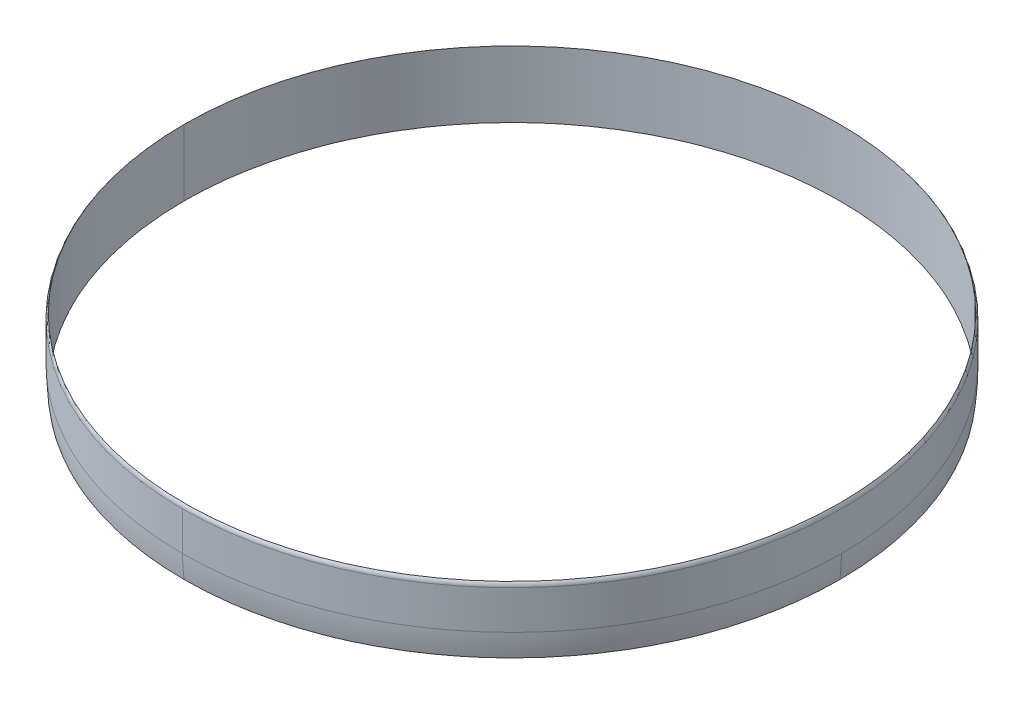
ISO-10303-21;
HEADER;
FILE_DESCRIPTION(('STEP AP214'),'2;1');
FILE_NAME('part.step','',(''),(''),'','','');
FILE_SCHEMA(('AUTOMOTIVE_DESIGN { 1 0 10303 214 1 1 1 1 }'));
ENDSEC;
DATA;
#1=APPLICATION_CONTEXT('core data for automotive mechanical design processes');
#2=APPLICATION_PROTOCOL_DEFINITION('international standard','automotive_design',2000,#1);
#3=PRODUCT_CONTEXT('',#1,'mechanical');
#4=PRODUCT('Part','Part','',(#3));
#5=PRODUCT_RELATED_PRODUCT_CATEGORY('part','',(#4));
#6=PRODUCT_DEFINITION_FORMATION('','',#4);
#7=PRODUCT_DEFINITION_CONTEXT('part definition',#1,'design');
#8=PRODUCT_DEFINITION('design','',#6,#7);
#9=PRODUCT_DEFINITION_SHAPE('','',#8);
#10=(LENGTH_UNIT() NAMED_UNIT(*) SI_UNIT(.MILLI.,.METRE.));
#11=(NAMED_UNIT(*) PLANE_ANGLE_UNIT() SI_UNIT($,.RADIAN.));
#12=(NAMED_UNIT(*) SI_UNIT($,.STERADIAN.) SOLID_ANGLE_UNIT());
#13=UNCERTAINTY_MEASURE_WITH_UNIT(LENGTH_MEASURE(1.E-05),#10,'distance_accuracy_value','');
#14=(GEOMETRIC_REPRESENTATION_CONTEXT(3) GLOBAL_UNCERTAINTY_ASSIGNED_CONTEXT((#13)) GLOBAL_UNIT_ASSIGNED_CONTEXT((#10,
#11,#12)) REPRESENTATION_CONTEXT('',''));
#15=CARTESIAN_POINT('',(0.,0.,0.));
#16=DIRECTION('',(0.,0.,1.));
#17=DIRECTION('',(1.,0.,0.));
#18=AXIS2_PLACEMENT_3D('',#15,#16,#17);
#19=CARTESIAN_POINT('',(5.07460071940085,-5.31215064223712,0.0398565952627643));
#20=CARTESIAN_POINT('',(5.07677797983758,-5.31215064223712,-0.239133826858269));
#21=CARTESIAN_POINT('',(5.0360574572875,-5.31215064223712,-0.784180289500473));
#22=CARTESIAN_POINT('',(4.84627020965909,-5.31215064223712,-1.57464950831854));
#23=CARTESIAN_POINT('',(4.5402783707503,-5.31215064223712,-2.3133870219321));
#24=CARTESIAN_POINT('',(4.12248568042579,-5.31215064223712,-2.99516129099835));
#25=CARTESIAN_POINT('',(3.60318481666137,-5.31215064223712,-3.60318481666137));
#26=CARTESIAN_POINT('',(2.99516129099835,-5.31215064223712,-4.12248568042579));
#27=CARTESIAN_POINT('',(2.3133870219321,-5.31215064223712,-4.5402783707503));
#28=CARTESIAN_POINT('',(1.5746495083188,-5.31215064223712,-4.84627020965909));
#29=CARTESIAN_POINT('',(0.784180289499751,-5.31215064223712,-5.03605745728761));
#30=CARTESIAN_POINT('',(0.23913382686036,-5.31215064223712,-5.07677797983765));
#31=CARTESIAN_POINT('',(-0.0398565952629927,-5.31215064223712,-5.07460071940084));
#32=CARTESIAN_POINT('',(5.07885840714978,-5.28018567461216,0.0398900357138964));
#33=CARTESIAN_POINT('',(5.0810374943511,-5.28018567461217,-0.239334464745136));
#34=CARTESIAN_POINT('',(5.04028280649672,-5.28018567461217,-0.784838231868048));
#35=CARTESIAN_POINT('',(4.85033632371177,-5.28018567461217,-1.57597066958663));
#36=CARTESIAN_POINT('',(4.54408775175589,-5.28018567461217,-2.31532799820335));
#37=CARTESIAN_POINT('',(4.12594452531678,-5.28018567461217,-2.9976742890127));
#38=CARTESIAN_POINT('',(3.60620795812466,-5.28018567461217,-3.60620795812466));
#39=CARTESIAN_POINT('',(2.9976742890127,-5.28018567461217,-4.12594452531678));
#40=CARTESIAN_POINT('',(2.31532799820335,-5.28018567461217,-4.54408775175589));
#41=CARTESIAN_POINT('',(1.57597066958688,-5.28018567461217,-4.85033632371177));
#42=CARTESIAN_POINT('',(0.784838231867325,-5.28018567461217,-5.04028280649684));
#43=CARTESIAN_POINT('',(0.239334464747247,-5.28018567461216,-5.08103749435117));
#44=CARTESIAN_POINT('',(-0.039890035714118,-5.28018567461216,-5.07885840714977));
#45=CARTESIAN_POINT('',(5.09287700843605,-5.15850268669196,0.0400001396902587));
#46=CARTESIAN_POINT('',(5.09506211032523,-5.15850268669196,-0.239995072733471));
#47=CARTESIAN_POINT('',(5.05419493189443,-5.15850268669196,-0.787004532513923));
#48=CARTESIAN_POINT('',(4.86372416121044,-5.15850268669196,-1.58032064406622));
#49=CARTESIAN_POINT('',(4.55663028578536,-5.15850268669196,-2.3217187375097));
#50=CARTESIAN_POINT('',(4.13733290565511,-5.15850268669196,-3.00594843199547));
#51=CARTESIAN_POINT('',(3.616161768109,-5.15850268669196,-3.616161768109));
#52=CARTESIAN_POINT('',(3.00594843199548,-5.15850268669196,-4.13733290565511));
#53=CARTESIAN_POINT('',(2.3217187375097,-5.15850268669196,-4.55663028578535));
#54=CARTESIAN_POINT('',(1.58032064406647,-5.15850268669196,-4.86372416121044));
#55=CARTESIAN_POINT('',(0.787004532513199,-5.15850268669196,-5.05419493189455));
#56=CARTESIAN_POINT('',(0.239995072735576,-5.15850268669196,-5.09506211032531));
#57=CARTESIAN_POINT('',(-0.0400001396904847,-5.15850268669196,-5.09287700843604));
#58=CARTESIAN_POINT('',(5.0999090152672,-5.03774586597889,0.04005537001587));
#59=CARTESIAN_POINT('',(5.1020971342436,-5.0377458659789,-0.240326446726554));
#60=CARTESIAN_POINT('',(5.06117352831954,-5.0377458659789,-0.788091191633832));
#61=CARTESIAN_POINT('',(4.87043976448689,-5.0377458659789,-1.58250267703967));
#62=CARTESIAN_POINT('',(4.56292186817567,-5.0377458659789,-2.32492445836126));
#63=CARTESIAN_POINT('',(4.14304554179493,-5.0377458659789,-3.01009890526681));
#64=CARTESIAN_POINT('',(3.62115479547207,-5.0377458659789,-3.62115479547207));
#65=CARTESIAN_POINT('',(3.01009890526932,-5.0377458659789,-4.14304554179493));
#66=CARTESIAN_POINT('',(2.32492445836126,-5.0377458659789,-4.56292186817315));
#67=CARTESIAN_POINT('',(1.58250267703993,-5.0377458659789,-4.87043976448689));
#68=CARTESIAN_POINT('',(0.788091191633347,-5.0377458659789,-5.06117352831966));
#69=CARTESIAN_POINT('',(0.24032644672771,-5.0377458659789,-5.10209713424367));
#70=CARTESIAN_POINT('',(-0.040055370015967,-5.0377458659789,-5.09990901526718));
#71=CARTESIAN_POINT('',(5.09983850957957,-4.94819430474783,0.0400548162547285));
#72=CARTESIAN_POINT('',(5.10202659830462,-4.94819430474783,-0.240323124239591));
#73=CARTESIAN_POINT('',(5.06110355814651,-4.94819430474783,-0.78808029635899));
#74=CARTESIAN_POINT('',(4.8703724311862,-4.94819430474783,-1.58248079911257));
#75=CARTESIAN_POINT('',(4.56285878627498,-4.94819430474783,-2.32489231653352));
#76=CARTESIAN_POINT('',(4.14298826464156,-4.94819430474783,-3.01005729097771));
#77=CARTESIAN_POINT('',(3.62110473340126,-4.94819430474783,-3.62110473340126));
#78=CARTESIAN_POINT('',(3.01005729097776,-4.94819430474783,-4.14298826464156));
#79=CARTESIAN_POINT('',(2.32489231653352,-4.94819430474783,-4.56285878627493));
#80=CARTESIAN_POINT('',(1.58248079911257,-4.94819430474783,-4.8703724311862));
#81=CARTESIAN_POINT('',(0.788080296358495,-4.94819430474783,-5.06110355814662));
#82=CARTESIAN_POINT('',(0.240323124240781,-4.94819430474783,-5.10202659830469));
#83=CARTESIAN_POINT('',(-0.040054816254826,-4.94819430474783,-5.09983850957956));
#84=B_SPLINE_SURFACE_WITH_KNOTS('',3,3,((#19,#20,#21,#22,#23,#24,#25,#26,#27,#28,#29,#30,#31),
(#32,#33,#34,#35,#36,#37,#38,#39,#40,#41,#42,#43,#44),(#45,#46,#47,#48,#49,#50,#51,#52,#53,#54,
#55,#56,#57),(#58,#59,#60,#61,#62,#63,#64,#65,#66,#67,#68,#69,#70),(#71,#72,#73,#74,#75,#76,#77,
#78,#79,#80,#81,#82,#83)),.UNSPECIFIED.,.F.,.F.,.F.,(4,1,4),(4,1,1,1,1,1,1,1,1,1,4),
(0.00378229550405859,0.264970651443808,0.995047089156655),(0.015000022706526,0.12,0.22,0.32,
0.42,0.52,0.62,0.72,0.82,0.92,1.02499997729366),.UNSPECIFIED.);
#85=CARTESIAN_POINT('',(5.07484010522801,-5.31034885046992,0.039858475431186));
#86=CARTESIAN_POINT('',(5.07701746837343,-5.31034885046992,-0.239145107597802));
#87=CARTESIAN_POINT('',(5.03629502490051,-5.31034885046992,-0.784217281898031));
#88=CARTESIAN_POINT('',(4.84649882437516,-5.31034885046992,-1.57472378978341));
#89=CARTESIAN_POINT('',(4.54049255081158,-5.31034885046992,-2.31349615210734));
#90=CARTESIAN_POINT('',(4.12268015181357,-5.31034885046992,-2.99530258273785));
#91=CARTESIAN_POINT('',(3.6033547908968,-5.31034885046992,-3.6033547908968));
#92=CARTESIAN_POINT('',(2.99530258273785,-5.31034885046992,-4.12268015181357));
#93=CARTESIAN_POINT('',(2.31349615210734,-5.31034885046992,-4.54049255081158));
#94=CARTESIAN_POINT('',(1.57472378978367,-5.31034885046992,-4.84649882437516));
#95=CARTESIAN_POINT('',(0.784217281897309,-5.31034885046992,-5.03629502490063));
#96=CARTESIAN_POINT('',(0.239145107599894,-5.31034885046992,-5.0770174683735));
#97=CARTESIAN_POINT('',(-0.039858475431414,-5.31034885046992,-5.07484010522799));
#98=B_SPLINE_CURVE_WITH_KNOTS('',3,(#85,#86,#87,#88,#89,#90,#91,#92,#93,#94,#95,#96,#97),
.UNSPECIFIED.,.F.,.F.,(4,1,1,1,1,1,1,1,1,1,4),(0.015000022706526,0.12,0.22,0.32,0.42,0.52,0.62,
0.72,0.82,0.92,1.02499997729366),.UNSPECIFIED.);
#99=CARTESIAN_POINT('',(-7.81112865682848E-11,-5.31034921607361,-5.07499724113776));
#100=VERTEX_POINT('',#99);
#101=CARTESIAN_POINT('',(5.07499724113776,-5.31034921601011,-7.81117187978163E-11));
#102=VERTEX_POINT('',#101);
#103=EDGE_CURVE('E10',#100,#102,#98,.F.);
#104=CARTESIAN_POINT('',(-3.1243119257094E-10,-5.31215064223712,-5.07475508916185));
#105=CARTESIAN_POINT('',(-3.12684391047665E-10,-5.28018567461216,-5.07901290643014));
#106=CARTESIAN_POINT('',(-3.13556941709489E-10,-5.15850268669196,-5.09303193416321));
#107=CARTESIAN_POINT('',(-3.14000497288582E-10,-5.0377458659789,-5.10006415490864));
#108=CARTESIAN_POINT('',(-3.13981855787479E-10,-4.94819430474783,-5.09999364707611));
#109=B_SPLINE_CURVE_WITH_KNOTS('',3,(#104,#105,#106,#107,#108),.UNSPECIFIED.,.F.,.F.,(4,1,4),
(0.00378229550405859,0.264970651443808,0.995047089156655),.UNSPECIFIED.);
#110=CARTESIAN_POINT('',(-7.84951123561546E-11,-4.95000000025452,-5.09999717886902));
#111=VERTEX_POINT('',#110);
#112=EDGE_CURVE('E26',#100,#111,#109,.T.);
#113=CARTESIAN_POINT('',(-0.0400548218362915,-4.95000000025453,-5.09983922022));
#114=CARTESIAN_POINT('',(0.240323157728767,-4.95000000025453,-5.10202730925005));
#115=CARTESIAN_POINT('',(0.788080406174072,-4.95000000025453,-5.0611042633895));
#116=CARTESIAN_POINT('',(1.58248101962443,-4.95000000025453,-4.87037310985154));
#117=CARTESIAN_POINT('',(2.32489264049721,-4.95000000025453,-4.56285942208955));
#118=CARTESIAN_POINT('',(3.01005771041626,-4.95000000025453,-4.14298884194904));
#119=CARTESIAN_POINT('',(3.62110523798653,-4.95000000025453,-3.62110523798653));
#120=CARTESIAN_POINT('',(4.14298884194904,-4.95000000025453,-3.01005771041616));
#121=CARTESIAN_POINT('',(4.56285942208966,-4.95000000025453,-2.32489264049721));
#122=CARTESIAN_POINT('',(4.87037310985154,-4.95000000025453,-1.58248101962442));
#123=CARTESIAN_POINT('',(5.06110426338938,-4.95000000025453,-0.788080406174567));
#124=CARTESIAN_POINT('',(5.10202730924997,-4.95000000025453,-0.240323157727578));
#125=CARTESIAN_POINT('',(5.09983922022001,-4.95000000025453,0.0400548218361941));
#126=B_SPLINE_CURVE_WITH_KNOTS('',3,(#113,#114,#115,#116,#117,#118,#119,#120,#121,#122,#123,
#124,#125),.UNSPECIFIED.,.F.,.F.,(4,1,1,1,1,1,1,1,1,1,4),(0.0150000227065259,0.12000000000019,
0.22000000000019,0.32000000000019,0.42000000000019,0.52000000000019,0.62000000000019,
0.72000000000019,0.82000000000019,0.92000000000019,1.02499997729366),.UNSPECIFIED.);
#127=CARTESIAN_POINT('',(5.09999717886903,-4.95000000017515,-7.84941047063996E-11));
#128=VERTEX_POINT('',#127);
#129=EDGE_CURVE('E398',#128,#111,#126,.F.);
#130=CARTESIAN_POINT('',(5.07475508917236,-5.31215064215816,-3.12433125500126E-10));
#131=CARTESIAN_POINT('',(5.07901290643622,-5.28018567455937,-3.12695243233786E-10));
#132=CARTESIAN_POINT('',(5.09303193416785,-5.15850268663872,-3.13556221731483E-10));
#133=CARTESIAN_POINT('',(5.10006415491176,-5.03774586592522,-3.13998901478509E-10));
#134=CARTESIAN_POINT('',(5.09999364707605,-4.94819430466676,-3.13985111782128E-10));
#135=B_SPLINE_CURVE_WITH_KNOTS('',3,(#130,#131,#132,#133,#134),.UNSPECIFIED.,.F.,.F.,(4,1,4),
(0.00378229571909672,0.264970651443594,0.99504708937697),.UNSPECIFIED.);
#136=EDGE_CURVE('E374',#102,#128,#135,.T.);
#137=ORIENTED_EDGE('',*,*,#103,.F.);
#138=ORIENTED_EDGE('',*,*,#112,.T.);
#139=ORIENTED_EDGE('',*,*,#129,.F.);
#140=ORIENTED_EDGE('',*,*,#136,.F.);
#141=EDGE_LOOP('',(#137,#138,#139,#140));
#142=FACE_BOUND('',#141,.T.);
#143=ADVANCED_FACE('F15',(#142),#84,.F.);
#144=CARTESIAN_POINT('',(-0.0398565952570717,-5.31215064215816,5.07460071941141));
#145=CARTESIAN_POINT('',(0.239133826861258,-5.31215064215816,5.07677797984782));
#146=CARTESIAN_POINT('',(0.784180289504398,-5.31215064215816,5.03605745729749));
#147=CARTESIAN_POINT('',(1.57464950832179,-5.31215064215816,4.84627020966913));
#148=CARTESIAN_POINT('',(2.31338702193689,-5.31215064215816,4.54027837075971));
#149=CARTESIAN_POINT('',(2.99516129100455,-5.31215064215816,4.12248568043434));
#150=CARTESIAN_POINT('',(3.60318481666883,-5.31215064215816,3.60318481666883));
#151=CARTESIAN_POINT('',(4.12248568043434,-5.31215064215816,2.99516129100455));
#152=CARTESIAN_POINT('',(4.54027837075971,-5.31215064215816,2.31338702193689));
#153=CARTESIAN_POINT('',(4.84627020966913,-5.31215064215816,1.5746495083218));
#154=CARTESIAN_POINT('',(5.03605745729751,-5.31215064215816,0.784180289503603));
#155=CARTESIAN_POINT('',(5.07677797984783,-5.31215064215816,0.239133826863158));
#156=CARTESIAN_POINT('',(5.0746007194114,-5.31215064215816,-0.0398565952573382));
#157=CARTESIAN_POINT('',(-0.0398900357081564,-5.28018567455937,5.07885840715591));
#158=CARTESIAN_POINT('',(0.23933446474794,-5.28018567455937,5.0810374943569));
#159=CARTESIAN_POINT('',(0.784838231871278,-5.28018567455937,5.04028280650232));
#160=CARTESIAN_POINT('',(1.57597066958825,-5.28018567455937,4.85033632371757));
#161=CARTESIAN_POINT('',(2.31532799820612,-5.28018567455937,4.54408775176133));
#162=CARTESIAN_POINT('',(2.99767428901629,-5.28018567455937,4.12594452532172));
#163=CARTESIAN_POINT('',(3.60620795812898,-5.28018567455937,3.60620795812898));
#164=CARTESIAN_POINT('',(4.12594452532172,-5.28018567455937,2.99767428901629));
#165=CARTESIAN_POINT('',(4.54408775176133,-5.28018567455937,2.31532799820612));
#166=CARTESIAN_POINT('',(4.85033632371757,-5.28018567455937,1.57597066958851));
#167=CARTESIAN_POINT('',(5.04028280650234,-5.28018567455937,0.784838231870492));
#168=CARTESIAN_POINT('',(5.08103749435691,-5.28018567455937,0.239334464749883));
#169=CARTESIAN_POINT('',(5.0788584071559,-5.28018567455937,-0.0398900357084412));
#170=CARTESIAN_POINT('',(-0.0400001396845016,-5.15850268663872,5.09287700844074));
#171=CARTESIAN_POINT('',(0.239995072736239,-5.15850268663872,5.09506211032959));
#172=CARTESIAN_POINT('',(0.787004532516935,-5.15850268663872,5.0541949318986));
#173=CARTESIAN_POINT('',(1.5803206440674,-5.15850268663872,4.86372416121487));
#174=CARTESIAN_POINT('',(2.32171873751182,-5.15850268663872,4.5566302857895));
#175=CARTESIAN_POINT('',(3.00594843199821,-5.15850268663872,4.13733290565888));
#176=CARTESIAN_POINT('',(3.6161617681123,-5.15850268663872,3.6161617681123));
#177=CARTESIAN_POINT('',(4.13733290565888,-5.15850268663872,3.00594843199821));
#178=CARTESIAN_POINT('',(4.55663028578951,-5.15850268663872,2.32171873751182));
#179=CARTESIAN_POINT('',(4.86372416121487,-5.15850268663872,1.58032064406766));
#180=CARTESIAN_POINT('',(5.05419493189861,-5.15850268663872,0.787004532515911));
#181=CARTESIAN_POINT('',(5.09506211032961,-5.15850268663872,0.239995072738367));
#182=CARTESIAN_POINT('',(5.09287700844073,-5.15850268663872,-0.0400001396847997));
#183=CARTESIAN_POINT('',(-0.0400553700101031,-5.03774586592522,5.09990901527036));
#184=CARTESIAN_POINT('',(0.240326446729322,-5.03774586592522,5.10209713424644));
#185=CARTESIAN_POINT('',(0.788091191636624,-5.03774586592522,5.0611735283222));
#186=CARTESIAN_POINT('',(1.58250267704064,-5.03774586592522,4.87043976448987));
#187=CARTESIAN_POINT('',(2.32492445836268,-5.03774586592522,4.56292186817595));
#188=CARTESIAN_POINT('',(3.01009890526865,-5.03774586592522,4.14304554179747));
#189=CARTESIAN_POINT('',(3.62115479547429,-5.03774586592522,3.62115479547429));
#190=CARTESIAN_POINT('',(4.14304554179747,-5.03774586592522,3.01009890526865));
#191=CARTESIAN_POINT('',(4.56292186817846,-5.03774586592522,2.32492445836268));
#192=CARTESIAN_POINT('',(4.87043976448987,-5.03774586592522,1.58250267704064));
#193=CARTESIAN_POINT('',(5.06117352832222,-5.03774586592522,0.788091191635826));
#194=CARTESIAN_POINT('',(5.10209713424645,-5.03774586592522,0.240326446731199));
#195=CARTESIAN_POINT('',(5.09990901527036,-5.03774586592522,-0.0400553700103787));
#196=CARTESIAN_POINT('',(-0.0400548162489352,-4.94819430466676,5.09983850957955));
#197=CARTESIAN_POINT('',(0.240323124242198,-4.94819430466676,5.10202659830427));
#198=CARTESIAN_POINT('',(0.788080296361041,-4.94819430466676,5.061103558146));
#199=CARTESIAN_POINT('',(1.5824807991123,-4.94819430466676,4.87037243118614));
#200=CARTESIAN_POINT('',(2.3248923165335,-4.94819430466676,4.56285878627487));
#201=CARTESIAN_POINT('',(3.01005729097768,-4.94819430466676,4.14298826464151));
#202=CARTESIAN_POINT('',(3.62110473340122,-4.94819430466676,3.62110473340122));
#203=CARTESIAN_POINT('',(4.14298826464151,-4.94819430466676,3.01005729097768));
#204=CARTESIAN_POINT('',(4.56285878627492,-4.94819430466676,2.3248923165335));
#205=CARTESIAN_POINT('',(4.87037243118614,-4.94819430466676,1.58248079911255));
#206=CARTESIAN_POINT('',(5.06110355814602,-4.94819430466676,0.788080296360256));
#207=CARTESIAN_POINT('',(5.10202659830428,-4.94819430466676,0.240323124244073));
#208=CARTESIAN_POINT('',(5.09983850957955,-4.94819430466676,-0.0400548162492105));
#209=B_SPLINE_SURFACE_WITH_KNOTS('',3,3,((#144,#145,#146,#147,#148,#149,#150,#151,#152,#153,
#154,#155,#156),(#157,#158,#159,#160,#161,#162,#163,#164,#165,#166,#167,#168,#169),(#170,#171,
#172,#173,#174,#175,#176,#177,#178,#179,#180,#181,#182),(#183,#184,#185,#186,#187,#188,#189,
#190,#191,#192,#193,#194,#195),(#196,#197,#198,#199,#200,#201,#202,#203,#204,#205,#206,#207,
#208)),.UNSPECIFIED.,.F.,.F.,.F.,(4,1,4),(4,1,1,1,1,1,1,1,1,1,4),(0.00378229571909672,
0.264970651443594,0.99504708937697),(0.0150000227072264,0.11999999999999,0.21999999999999,
0.31999999999999,0.41999999999999,0.51999999999999,0.61999999999999,0.71999999999999,
0.81999999999999,0.91999999999999,1.02499997729279),.UNSPECIFIED.);
#210=CARTESIAN_POINT('',(-0.0398584754256699,-5.3103488502203,5.07484010526113));
#211=CARTESIAN_POINT('',(0.239145107601856,-5.3103488502203,5.07701746840624));
#212=CARTESIAN_POINT('',(0.784217281905442,-5.3103488502203,5.0362950249329));
#213=CARTESIAN_POINT('',(1.57472378979365,-5.3103488502203,4.84649882440675));
#214=CARTESIAN_POINT('',(2.31349615212242,-5.3103488502203,4.54049255084118));
#215=CARTESIAN_POINT('',(2.99530258275738,-5.3103488502203,4.12268015184044));
#216=CARTESIAN_POINT('',(3.60335479092028,-5.3103488502203,3.60335479092028));
#217=CARTESIAN_POINT('',(4.12268015184044,-5.3103488502203,2.99530258275738));
#218=CARTESIAN_POINT('',(4.54049255084118,-5.3103488502203,2.31349615212242));
#219=CARTESIAN_POINT('',(4.84649882440675,-5.3103488502203,1.57472378979367));
#220=CARTESIAN_POINT('',(5.03629502493292,-5.3103488502203,0.784217281904647));
#221=CARTESIAN_POINT('',(5.07701746840626,-5.3103488502203,0.239145107603758));
#222=CARTESIAN_POINT('',(5.07484010526113,-5.3103488502203,-0.0398584754259374));
#223=B_SPLINE_CURVE_WITH_KNOTS('',3,(#210,#211,#212,#213,#214,#215,#216,#217,#218,#219,#220,
#221,#222),.UNSPECIFIED.,.F.,.F.,(4,1,1,1,1,1,1,1,1,1,4),(0.0150000227072264,0.11999999999999,
0.21999999999999,0.31999999999999,0.41999999999999,0.51999999999999,0.61999999999999,
0.71999999999999,0.81999999999999,0.91999999999999,1.02499997729279),.UNSPECIFIED.);
#224=CARTESIAN_POINT('',(-2.38083561135862E-13,-5.31034921601011,5.07499724113776));
#225=VERTEX_POINT('',#224);
#226=EDGE_CURVE('E289',#102,#225,#223,.F.);
#227=CARTESIAN_POINT('',(5.09983922022005,-4.95000000008783,-0.0400548218306766));
#228=CARTESIAN_POINT('',(5.1020273092497,-4.95000000008783,0.240323157732064));
#229=CARTESIAN_POINT('',(5.06110426338896,-4.95000000008783,0.788080406175848));
#230=CARTESIAN_POINT('',(4.87037310985154,-4.95000000008783,1.58248101962442));
#231=CARTESIAN_POINT('',(4.56285942208966,-4.95000000008783,2.32489264049721));
#232=CARTESIAN_POINT('',(4.14298884194904,-4.95000000008783,3.01005771041616));
#233=CARTESIAN_POINT('',(3.62110523798653,-4.95000000008783,3.62110523798653));
#234=CARTESIAN_POINT('',(3.01005771041616,-4.95000000008783,4.14298884194904));
#235=CARTESIAN_POINT('',(2.32489264049721,-4.95000000008783,4.56285942208955));
#236=CARTESIAN_POINT('',(1.58248101962418,-4.95000000008783,4.87037310985154));
#237=CARTESIAN_POINT('',(0.788080406176632,-4.95000000008783,5.06110426338894));
#238=CARTESIAN_POINT('',(0.240323157730188,-4.95000000008783,5.10202730924969));
#239=CARTESIAN_POINT('',(-0.0400548218304012,-4.95000000008783,5.09983922022005));
#240=B_SPLINE_CURVE_WITH_KNOTS('',3,(#227,#228,#229,#230,#231,#232,#233,#234,#235,#236,#237,
#238,#239),.UNSPECIFIED.,.F.,.F.,(4,1,1,1,1,1,1,1,1,1,4),(0.0150000227072264,0.120000000000026,
0.220000000000026,0.320000000000026,0.420000000000026,0.520000000000026,0.620000000000026,
0.720000000000026,0.820000000000026,0.920000000000026,1.02499997729279),.UNSPECIFIED.);
#241=CARTESIAN_POINT('',(-9.29964012529017E-13,-4.95000000017515,5.09999717886902));
#242=VERTEX_POINT('',#241);
#243=EDGE_CURVE('E287',#242,#128,#240,.F.);
#244=CARTESIAN_POINT('',(3.12426283167978E-10,-5.31215064223712,5.07475508916185));
#245=CARTESIAN_POINT('',(3.12689115797445E-10,-5.28018567461217,5.07901290643013));
#246=CARTESIAN_POINT('',(3.13562100140137E-10,-5.15850268669197,5.09303193416321));
#247=CARTESIAN_POINT('',(3.13991694922194E-10,-5.0377458659789,5.10006415490864));
#248=CARTESIAN_POINT('',(3.13987280186473E-10,-4.94819430474783,5.09999364707611));
#249=B_SPLINE_CURVE_WITH_KNOTS('',3,(#244,#245,#246,#247,#248),.UNSPECIFIED.,.F.,.F.,(4,1,4),
(0.00378229550404038,0.264970651443381,0.995047089156651),.UNSPECIFIED.);
#250=EDGE_CURVE('E282',#225,#242,#249,.T.);
#251=ORIENTED_EDGE('',*,*,#226,.F.);
#252=ORIENTED_EDGE('',*,*,#136,.T.);
#253=ORIENTED_EDGE('',*,*,#243,.F.);
#254=ORIENTED_EDGE('',*,*,#250,.F.);
#255=EDGE_LOOP('',(#251,#252,#253,#254));
#256=FACE_BOUND('',#255,.T.);
#257=ADVANCED_FACE('F245',(#256),#209,.F.);
#258=CARTESIAN_POINT('',(-5.07460071940085,-5.31215064223712,-0.0398565952625982));
#259=CARTESIAN_POINT('',(-5.07677797983757,-5.31215064223712,0.239133826857249));
#260=CARTESIAN_POINT('',(-5.03605745728749,-5.31215064223712,0.784180289500976));
#261=CARTESIAN_POINT('',(-4.84627020965909,-5.31215064223712,1.57464950831852));
#262=CARTESIAN_POINT('',(-4.5402783707503,-5.31215064223712,2.3133870219321));
#263=CARTESIAN_POINT('',(-4.12248568042579,-5.31215064223712,2.99516129099835));
#264=CARTESIAN_POINT('',(-3.60318481666137,-5.31215064223712,3.60318481666137));
#265=CARTESIAN_POINT('',(-2.99516129099835,-5.31215064223712,4.12248568042579));
#266=CARTESIAN_POINT('',(-2.31338702193185,-5.31215064223712,4.5402783707503));
#267=CARTESIAN_POINT('',(-1.57464950831879,-5.31215064223712,4.84627020965909));
#268=CARTESIAN_POINT('',(-0.784180289499905,-5.31215064223712,5.03605745728763));
#269=CARTESIAN_POINT('',(-0.239133826860253,-5.31215064223712,5.07677797983766));
#270=CARTESIAN_POINT('',(0.0398565952629524,-5.31215064223712,5.07460071940083));
#271=CARTESIAN_POINT('',(-5.07885840714978,-5.28018567461217,-0.0398900357137457));
#272=CARTESIAN_POINT('',(-5.08103749435109,-5.28018567461217,0.239334464744115));
#273=CARTESIAN_POINT('',(-5.04028280649672,-5.28018567461217,0.784838231868537));
#274=CARTESIAN_POINT('',(-4.85033632371177,-5.28018567461217,1.57597066958637));
#275=CARTESIAN_POINT('',(-4.54408775175589,-5.28018567461217,2.31532799820335));
#276=CARTESIAN_POINT('',(-4.12594452531678,-5.28018567461217,2.9976742890127));
#277=CARTESIAN_POINT('',(-3.60620795812466,-5.28018567461217,3.60620795812466));
#278=CARTESIAN_POINT('',(-2.9976742890127,-5.28018567461217,4.12594452531678));
#279=CARTESIAN_POINT('',(-2.3153279982031,-5.28018567461217,4.54408775175589));
#280=CARTESIAN_POINT('',(-1.57597066958688,-5.28018567461217,4.85033632371177));
#281=CARTESIAN_POINT('',(-0.784838231867477,-5.28018567461217,5.04028280649686));
#282=CARTESIAN_POINT('',(-0.239334464747054,-5.28018567461217,5.08103749435118));
#283=CARTESIAN_POINT('',(0.0398900357140756,-5.28018567461217,5.07885840714977));
#284=CARTESIAN_POINT('',(-5.09287700843605,-5.15850268669197,-0.0400001396900993));
#285=CARTESIAN_POINT('',(-5.09506211032523,-5.15850268669197,0.239995072732461));
#286=CARTESIAN_POINT('',(-5.05419493189442,-5.15850268669197,0.787004532514174));
#287=CARTESIAN_POINT('',(-4.86372416121044,-5.15850268669197,1.58032064406596));
#288=CARTESIAN_POINT('',(-4.55663028578535,-5.15850268669197,2.3217187375097));
#289=CARTESIAN_POINT('',(-4.13733290565511,-5.15850268669197,3.00594843199547));
#290=CARTESIAN_POINT('',(-3.616161768109,-5.15850268669197,3.616161768109));
#291=CARTESIAN_POINT('',(-3.00594843199547,-5.15850268669197,4.13733290565511));
#292=CARTESIAN_POINT('',(-2.3217187375097,-5.15850268669197,4.55663028578535));
#293=CARTESIAN_POINT('',(-1.58032064406622,-5.15850268669197,4.86372416121044));
#294=CARTESIAN_POINT('',(-0.7870045325131,-5.15850268669197,5.05419493189457));
#295=CARTESIAN_POINT('',(-0.239995072735245,-5.15850268669197,5.09506211032532));
#296=CARTESIAN_POINT('',(0.0400001396904207,-5.15850268669197,5.09287700843604));
#297=CARTESIAN_POINT('',(-5.0999090152672,-5.0377458659789,-0.0400553700157132));
#298=CARTESIAN_POINT('',(-5.10209713424359,-5.0377458659789,0.240326446725599));
#299=CARTESIAN_POINT('',(-5.06117352831953,-5.0377458659789,0.788091191634332));
#300=CARTESIAN_POINT('',(-4.87043976448689,-5.0377458659789,1.58250267703967));
#301=CARTESIAN_POINT('',(-4.56292186817315,-5.0377458659789,2.32492445836126));
#302=CARTESIAN_POINT('',(-4.14304554179493,-5.0377458659789,3.01009890526681));
#303=CARTESIAN_POINT('',(-3.62115479547207,-5.0377458659789,3.62115479547207));
#304=CARTESIAN_POINT('',(-3.01009890526681,-5.0377458659789,4.14304554179493));
#305=CARTESIAN_POINT('',(-2.32492445836126,-5.0377458659789,4.56292186817315));
#306=CARTESIAN_POINT('',(-1.58250267703993,-5.0377458659789,4.87043976448689));
#307=CARTESIAN_POINT('',(-0.788091191633018,-5.0377458659789,5.06117352831968));
#308=CARTESIAN_POINT('',(-0.240326446728695,-5.0377458659789,5.10209713424368));
#309=CARTESIAN_POINT('',(0.0400553700160882,-5.0377458659789,5.09990901526718));
#310=CARTESIAN_POINT('',(-5.09983850957957,-4.94819430474783,-0.0400548162545866));
#311=CARTESIAN_POINT('',(-5.10202659830461,-4.94819430474783,0.240323124238625));
#312=CARTESIAN_POINT('',(-5.0611035581465,-4.94819430474783,0.788080296359244));
#313=CARTESIAN_POINT('',(-4.8703724311862,-4.94819430474783,1.58248079911232));
#314=CARTESIAN_POINT('',(-4.56285878627493,-4.94819430474783,2.32489231653352));
#315=CARTESIAN_POINT('',(-4.14298826464156,-4.94819430474783,3.01005729097771));
#316=CARTESIAN_POINT('',(-3.62110473340126,-4.94819430474783,3.62110473340126));
#317=CARTESIAN_POINT('',(-3.01005729097771,-4.94819430474783,4.14298826464156));
#318=CARTESIAN_POINT('',(-2.32489231653352,-4.94819430474783,4.56285878627493));
#319=CARTESIAN_POINT('',(-1.58248079911257,-4.94819430474783,4.8703724311862));
#320=CARTESIAN_POINT('',(-0.788080296357928,-4.94819430474783,5.06110355814664));
#321=CARTESIAN_POINT('',(-0.240323124241704,-4.94819430474783,5.10202659830471));
#322=CARTESIAN_POINT('',(0.0400548162549532,-4.94819430474783,5.09983850957956));
#323=B_SPLINE_SURFACE_WITH_KNOTS('',3,3,((#258,#259,#260,#261,#262,#263,#264,#265,#266,#267,
#268,#269,#270),(#271,#272,#273,#274,#275,#276,#277,#278,#279,#280,#281,#282,#283),(#284,#285,
#286,#287,#288,#289,#290,#291,#292,#293,#294,#295,#296),(#297,#298,#299,#300,#301,#302,#303,
#304,#305,#306,#307,#308,#309),(#310,#311,#312,#313,#314,#315,#316,#317,#318,#319,#320,#321,
#322)),.UNSPECIFIED.,.F.,.F.,.F.,(4,1,4),(4,1,1,1,1,1,1,1,1,1,4),(0.00378229550404038,
0.264970651443381,0.995047089156651),(0.0150000227065333,0.12,0.22,0.32,0.42,0.52,0.62,0.72,
0.82,0.92,1.0249999772937),.UNSPECIFIED.);
#324=CARTESIAN_POINT('',(-5.07484010522801,-5.31034885046992,-0.0398584754310207));
#325=CARTESIAN_POINT('',(-5.07701746837343,-5.31034885046992,0.239145107596782));
#326=CARTESIAN_POINT('',(-5.03629502490051,-5.31034885046992,0.784217281898532));
#327=CARTESIAN_POINT('',(-4.84649882437516,-5.31034885046992,1.57472378978339));
#328=CARTESIAN_POINT('',(-4.54049255081158,-5.31034885046992,2.31349615210734));
#329=CARTESIAN_POINT('',(-4.12268015181357,-5.31034885046992,2.99530258273785));
#330=CARTESIAN_POINT('',(-3.60335479089679,-5.31034885046992,3.60335479089679));
#331=CARTESIAN_POINT('',(-2.99530258273785,-5.31034885046992,4.12268015181357));
#332=CARTESIAN_POINT('',(-2.31349615210709,-5.31034885046992,4.54049255081158));
#333=CARTESIAN_POINT('',(-1.57472378978367,-5.31034885046992,4.84649882437516));
#334=CARTESIAN_POINT('',(-0.784217281897462,-5.31034885046992,5.03629502490065));
#335=CARTESIAN_POINT('',(-0.239145107599782,-5.31034885046992,5.07701746837351));
#336=CARTESIAN_POINT('',(0.0398584754313735,-5.31034885046992,5.07484010522799));
#337=B_SPLINE_CURVE_WITH_KNOTS('',3,(#324,#325,#326,#327,#328,#329,#330,#331,#332,#333,#334,
#335,#336),.UNSPECIFIED.,.F.,.F.,(4,1,1,1,1,1,1,1,1,1,4),(0.0150000227065333,0.12,0.22,0.32,
0.42,0.52,0.62,0.72,0.82,0.92,1.0249999772937),.UNSPECIFIED.);
#338=CARTESIAN_POINT('',(-5.07499724113776,-5.31034921607361,-2.3694457366658E-13));
#339=VERTEX_POINT('',#338);
#340=EDGE_CURVE('E283',#225,#339,#337,.F.);
#341=CARTESIAN_POINT('',(0.0400548218364186,-4.95000000025453,5.09983922021999));
#342=CARTESIAN_POINT('',(-0.240323157729692,-4.95000000025453,5.10202730925006));
#343=CARTESIAN_POINT('',(-0.788080406173509,-4.95000000025453,5.06110426338952));
#344=CARTESIAN_POINT('',(-1.58248101962443,-4.95000000025453,4.87037310985154));
#345=CARTESIAN_POINT('',(-2.32489264049721,-4.95000000025453,4.56285942208956));
#346=CARTESIAN_POINT('',(-3.01005771041616,-4.95000000025453,4.14298884194904));
#347=CARTESIAN_POINT('',(-3.62110523798653,-4.95000000025453,3.62110523798653));
#348=CARTESIAN_POINT('',(-4.14298884194904,-4.95000000025453,3.01005771041616));
#349=CARTESIAN_POINT('',(-4.56285942208956,-4.95000000025453,2.32489264049721));
#350=CARTESIAN_POINT('',(-4.87037310985154,-4.95000000025453,1.58248101962418));
#351=CARTESIAN_POINT('',(-5.06110426338938,-4.95000000025453,0.788080406174826));
#352=CARTESIAN_POINT('',(-5.10202730924997,-4.95000000025453,0.240323157726613));
#353=CARTESIAN_POINT('',(-5.09983922022001,-4.95000000025453,-0.0400548218360519));
#354=B_SPLINE_CURVE_WITH_KNOTS('',3,(#341,#342,#343,#344,#345,#346,#347,#348,#349,#350,#351,
#352,#353),.UNSPECIFIED.,.F.,.F.,(4,1,1,1,1,1,1,1,1,1,4),(0.0150000227065332,0.120000000000231,
0.220000000000231,0.320000000000231,0.420000000000231,0.520000000000231,0.620000000000231,
0.720000000000231,0.820000000000231,0.920000000000231,1.0249999772937),.UNSPECIFIED.);
#355=CARTESIAN_POINT('',(-5.09999717886902,-4.95000000025452,-9.3092141150566E-13));
#356=VERTEX_POINT('',#355);
#357=EDGE_CURVE('E273',#356,#242,#354,.F.);
#358=CARTESIAN_POINT('',(-5.07475508916185,-5.31215064223712,3.12436794846853E-10));
#359=CARTESIAN_POINT('',(-5.07901290643013,-5.28018567461217,3.1268942750557E-10));
#360=CARTESIAN_POINT('',(-5.09303193416321,-5.15850268669199,3.1356501223941E-10));
#361=CARTESIAN_POINT('',(-5.10006415490863,-5.03774586597895,3.13985687764532E-10));
#362=CARTESIAN_POINT('',(-5.09999364707611,-4.94819430474791,3.13995398150239E-10));
#363=B_SPLINE_CURVE_WITH_KNOTS('',3,(#358,#359,#360,#361,#362),.UNSPECIFIED.,.F.,.F.,(4,1,4),
(0.00378229550405057,0.264970651443594,0.995047089156434),.UNSPECIFIED.);
#364=EDGE_CURVE('E219',#339,#356,#363,.T.);
#365=ORIENTED_EDGE('',*,*,#340,.F.);
#366=ORIENTED_EDGE('',*,*,#250,.T.);
#367=ORIENTED_EDGE('',*,*,#357,.F.);
#368=ORIENTED_EDGE('',*,*,#364,.F.);
#369=EDGE_LOOP('',(#365,#366,#367,#368));
#370=FACE_BOUND('',#369,.T.);
#371=ADVANCED_FACE('F235',(#370),#323,.F.);
#372=CARTESIAN_POINT('',(0.0398565952627913,-5.31215064223712,-5.07460071940085));
#373=CARTESIAN_POINT('',(-0.239133826858601,-5.31215064223712,-5.07677797983758));
#374=CARTESIAN_POINT('',(-0.784180289500429,-5.31215064223712,-5.03605745728751));
#375=CARTESIAN_POINT('',(-1.57464950831854,-5.31215064223712,-4.84627020965909));
#376=CARTESIAN_POINT('',(-2.3133870219321,-5.31215064223712,-4.5402783707503));
#377=CARTESIAN_POINT('',(-2.99516129099835,-5.31215064223712,-4.12248568042579));
#378=CARTESIAN_POINT('',(-3.60318481666137,-5.31215064223712,-3.60318481666137));
#379=CARTESIAN_POINT('',(-4.12248568042579,-5.31215064223712,-2.99516129099835));
#380=CARTESIAN_POINT('',(-4.5402783707503,-5.31215064223712,-2.3133870219321));
#381=CARTESIAN_POINT('',(-4.84627020965909,-5.31215064223712,-1.57464950831878));
#382=CARTESIAN_POINT('',(-5.03605745728751,-5.31215064223712,-0.784180289500175));
#383=CARTESIAN_POINT('',(-5.07677797983759,-5.31215064223712,-0.239133826858985));
#384=CARTESIAN_POINT('',(-5.07460071940085,-5.31215064223712,0.0398565952628372));
#385=CARTESIAN_POINT('',(0.0398900357139229,-5.28018567461217,-5.07885840714978));
#386=CARTESIAN_POINT('',(-0.239334464745468,-5.28018567461217,-5.0810374943511));
#387=CARTESIAN_POINT('',(-0.784838231868002,-5.28018567461217,-5.04028280649673));
#388=CARTESIAN_POINT('',(-1.57597066958663,-5.28018567461217,-4.85033632371177));
#389=CARTESIAN_POINT('',(-2.31532799820335,-5.28018567461217,-4.54408775175589));
#390=CARTESIAN_POINT('',(-2.9976742890127,-5.28018567461217,-4.12594452531678));
#391=CARTESIAN_POINT('',(-3.60620795812466,-5.28018567461217,-3.60620795812466));
#392=CARTESIAN_POINT('',(-4.12594452531678,-5.28018567461217,-2.9976742890127));
#393=CARTESIAN_POINT('',(-4.54408775175589,-5.28018567461217,-2.31532799820335));
#394=CARTESIAN_POINT('',(-4.85033632371177,-5.28018567461217,-1.57597066958663));
#395=CARTESIAN_POINT('',(-5.04028280649674,-5.28018567461217,-0.784838231867736));
#396=CARTESIAN_POINT('',(-5.0810374943511,-5.28018567461217,-0.239334464745937));
#397=CARTESIAN_POINT('',(-5.07885840714978,-5.28018567461217,0.0398900357139719));
#398=CARTESIAN_POINT('',(0.0400001396902921,-5.15850268669199,-5.09287700843605));
#399=CARTESIAN_POINT('',(-0.23999507273377,-5.15850268669199,-5.09506211032523));
#400=CARTESIAN_POINT('',(-0.787004532513638,-5.15850268669199,-5.05419493189443));
#401=CARTESIAN_POINT('',(-1.58032064406622,-5.15850268669199,-4.86372416121044));
#402=CARTESIAN_POINT('',(-2.3217187375097,-5.15850268669199,-4.55663028578535));
#403=CARTESIAN_POINT('',(-3.00594843199547,-5.15850268669199,-4.13733290565511));
#404=CARTESIAN_POINT('',(-3.616161768109,-5.15850268669199,-3.616161768109));
#405=CARTESIAN_POINT('',(-4.13733290565511,-5.15850268669199,-3.00594843199547));
#406=CARTESIAN_POINT('',(-4.55663028578534,-5.15850268669199,-2.3217187375097));
#407=CARTESIAN_POINT('',(-4.86372416121044,-5.15850268669199,-1.58032064406622));
#408=CARTESIAN_POINT('',(-5.05419493189444,-5.15850268669199,-0.787004532513374));
#409=CARTESIAN_POINT('',(-5.09506211032524,-5.15850268669199,-0.239995072734411));
#410=CARTESIAN_POINT('',(-5.09287700843605,-5.15850268669199,0.0400001396903637));
#411=CARTESIAN_POINT('',(0.0400553700158971,-5.03774586597895,-5.09990901526719));
#412=CARTESIAN_POINT('',(-0.240326446726884,-5.03774586597895,-5.1020971342436));
#413=CARTESIAN_POINT('',(-0.788091191633785,-5.03774586597895,-5.06117352831954));
#414=CARTESIAN_POINT('',(-1.58250267703967,-5.03774586597895,-4.87043976448689));
#415=CARTESIAN_POINT('',(-2.32492445836125,-5.03774586597895,-4.56292186817566));
#416=CARTESIAN_POINT('',(-3.01009890526681,-5.03774586597895,-4.14304554179492));
#417=CARTESIAN_POINT('',(-3.62115479547207,-5.03774586597895,-3.62115479547207));
#418=CARTESIAN_POINT('',(-4.14304554179492,-5.03774586597895,-3.01009890526681));
#419=CARTESIAN_POINT('',(-4.56292186817315,-5.03774586597895,-2.32492445836125));
#420=CARTESIAN_POINT('',(-4.87043976448689,-5.03774586597895,-1.58250267703993));
#421=CARTESIAN_POINT('',(-5.06117352831955,-5.03774586597895,-0.788091191633771));
#422=CARTESIAN_POINT('',(-5.1020971342436,-5.03774586597895,-0.240326446727037));
#423=CARTESIAN_POINT('',(-5.09990901526719,-5.03774586597895,0.0400553700158961));
#424=CARTESIAN_POINT('',(0.0400548162547703,-4.94819430474791,-5.09983850957957));
#425=CARTESIAN_POINT('',(-0.240323124239912,-4.94819430474791,-5.10202659830462));
#426=CARTESIAN_POINT('',(-0.788080296358709,-4.94819430474791,-5.06110355814652));
#427=CARTESIAN_POINT('',(-1.58248079911257,-4.94819430474791,-4.8703724311862));
#428=CARTESIAN_POINT('',(-2.32489231653352,-4.94819430474791,-4.56285878627498));
#429=CARTESIAN_POINT('',(-3.01005729097771,-4.94819430474791,-4.14298826464156));
#430=CARTESIAN_POINT('',(-3.62110473340126,-4.94819430474791,-3.62110473340126));
#431=CARTESIAN_POINT('',(-4.14298826464156,-4.94819430474791,-3.01005729097771));
#432=CARTESIAN_POINT('',(-4.56285878627493,-4.94819430474791,-2.32489231653352));
#433=CARTESIAN_POINT('',(-4.8703724311862,-4.94819430474791,-1.58248079911257));
#434=CARTESIAN_POINT('',(-5.06110355814652,-4.94819430474791,-0.788080296358685));
#435=CARTESIAN_POINT('',(-5.10202659830463,-4.94819430474791,-0.240323124240037));
#436=CARTESIAN_POINT('',(-5.09983850957957,-4.94819430474791,0.0400548162547762));
#437=B_SPLINE_SURFACE_WITH_KNOTS('',3,3,((#372,#373,#374,#375,#376,#377,#378,#379,#380,#381,
#382,#383,#384),(#385,#386,#387,#388,#389,#390,#391,#392,#393,#394,#395,#396,#397),(#398,#399,
#400,#401,#402,#403,#404,#405,#406,#407,#408,#409,#410),(#411,#412,#413,#414,#415,#416,#417,
#418,#419,#420,#421,#422,#423),(#424,#425,#426,#427,#428,#429,#430,#431,#432,#433,#434,#435,
#436)),.UNSPECIFIED.,.F.,.F.,.F.,(4,1,4),(4,1,1,1,1,1,1,1,1,1,4),(0.00378229550405057,
0.264970651443594,0.995047089156434),(0.0150000227065082,0.11999999999998,0.21999999999998,
0.31999999999998,0.41999999999998,0.51999999999998,0.61999999999998,0.71999999999998,
0.81999999999998,0.91999999999998,1.02499997729348),.UNSPECIFIED.);
#438=CARTESIAN_POINT('',(0.0398584754312129,-5.31034885046992,-5.074840105228));
#439=CARTESIAN_POINT('',(-0.239145107598134,-5.31034885046992,-5.07701746837344));
#440=CARTESIAN_POINT('',(-0.784217281897987,-5.31034885046992,-5.03629502490052));
#441=CARTESIAN_POINT('',(-1.57472378978341,-5.31034885046992,-4.84649882437516));
#442=CARTESIAN_POINT('',(-2.31349615210734,-5.31034885046992,-4.54049255081158));
#443=CARTESIAN_POINT('',(-2.99530258273785,-5.31034885046992,-4.12268015181357));
#444=CARTESIAN_POINT('',(-3.6033547908968,-5.31034885046992,-3.6033547908968));
#445=CARTESIAN_POINT('',(-4.12268015181357,-5.31034885046992,-2.99530258273785));
#446=CARTESIAN_POINT('',(-4.54049255081158,-5.31034885046992,-2.31349615210734));
#447=CARTESIAN_POINT('',(-4.84649882437516,-5.31034885046992,-1.57472378978365));
#448=CARTESIAN_POINT('',(-5.03629502490053,-5.31034885046992,-0.784217281897732));
#449=CARTESIAN_POINT('',(-5.07701746837344,-5.31034885046992,-0.239145107598522));
#450=CARTESIAN_POINT('',(-5.074840105228,-5.31034885046992,0.039858475431259));
#451=B_SPLINE_CURVE_WITH_KNOTS('',3,(#438,#439,#440,#441,#442,#443,#444,#445,#446,#447,#448,
#449,#450),.UNSPECIFIED.,.F.,.F.,(4,1,1,1,1,1,1,1,1,1,4),(0.0150000227065082,0.11999999999998,
0.21999999999998,0.31999999999998,0.41999999999998,0.51999999999998,0.61999999999998,
0.71999999999998,0.81999999999998,0.91999999999998,1.02499997729348),.UNSPECIFIED.);
#452=EDGE_CURVE('E229',#339,#100,#451,.F.);
#453=CARTESIAN_POINT('',(-5.09983922022001,-4.95000000025453,0.0400548218362413));
#454=CARTESIAN_POINT('',(-5.10202730924998,-4.95000000025453,-0.240323157728025));
#455=CARTESIAN_POINT('',(-5.0611042633894,-4.95000000025453,-0.788080406174267));
#456=CARTESIAN_POINT('',(-4.87037310985154,-4.95000000025453,-1.58248101962443));
#457=CARTESIAN_POINT('',(-4.56285942208956,-4.95000000025453,-2.32489264049721));
#458=CARTESIAN_POINT('',(-4.14298884194904,-4.95000000025453,-3.01005771041616));
#459=CARTESIAN_POINT('',(-3.62110523798653,-4.95000000025453,-3.62110523798653));
#460=CARTESIAN_POINT('',(-3.01005771041616,-4.95000000025453,-4.14298884194904));
#461=CARTESIAN_POINT('',(-2.32489264049721,-4.95000000025453,-4.56285942208965));
#462=CARTESIAN_POINT('',(-1.58248101962442,-4.95000000025453,-4.87037310985154));
#463=CARTESIAN_POINT('',(-0.78808040617429,-4.95000000025453,-5.06110426338939));
#464=CARTESIAN_POINT('',(-0.240323157727899,-4.95000000025453,-5.10202730924998));
#465=CARTESIAN_POINT('',(0.0400548218362356,-4.95000000025453,-5.09983922022001));
#466=B_SPLINE_CURVE_WITH_KNOTS('',3,(#453,#454,#455,#456,#457,#458,#459,#460,#461,#462,#463,
#464,#465),.UNSPECIFIED.,.F.,.F.,(4,1,1,1,1,1,1,1,1,1,4),(0.0150000227065081,0.120000000000008,
0.220000000000008,0.320000000000008,0.420000000000008,0.520000000000008,0.620000000000008,
0.720000000000008,0.820000000000008,0.920000000000008,1.02499997729348),.UNSPECIFIED.);
#467=EDGE_CURVE('E185',#111,#356,#466,.F.);
#468=ORIENTED_EDGE('',*,*,#452,.F.);
#469=ORIENTED_EDGE('',*,*,#364,.T.);
#470=ORIENTED_EDGE('',*,*,#467,.F.);
#471=ORIENTED_EDGE('',*,*,#112,.F.);
#472=EDGE_LOOP('',(#468,#469,#470,#471));
#473=FACE_BOUND('',#472,.T.);
#474=ADVANCED_FACE('F166',(#473),#437,.F.);
#475=CARTESIAN_POINT('',(0.,-4.25000000000078,0.));
#476=DIRECTION('',(0.,-1.,0.));
#477=DIRECTION('',(1.,0.,0.));
#478=AXIS2_PLACEMENT_3D('',#475,#476,#477);
#479=CYLINDRICAL_SURFACE('',#478,5.1);
#480=DIRECTION('',(0.,-1.,0.));
#481=VECTOR('',#480,1.);
#482=CARTESIAN_POINT('',(4.65935554000911E-13,-4.35000000025438,-5.1));
#483=LINE('',#482,#481);
#484=CARTESIAN_POINT('',(0.,-4.35000000025438,-5.1));
#485=VERTEX_POINT('',#484);
#486=EDGE_CURVE('E146',#485,#111,#483,.T.);
#487=ORIENTED_EDGE('',*,*,#486,.T.);
#488=ORIENTED_EDGE('',*,*,#467,.T.);
#489=ORIENTED_EDGE('',*,*,#357,.T.);
#490=DIRECTION('',(0.,-1.,0.));
#491=VECTOR('',#490,1.);
#492=CARTESIAN_POINT('',(0.,-4.35000000025438,5.1));
#493=LINE('',#492,#491);
#494=CARTESIAN_POINT('',(0.,-4.35000000025438,5.1));
#495=VERTEX_POINT('',#494);
#496=EDGE_CURVE('E141',#495,#242,#493,.T.);
#497=ORIENTED_EDGE('',*,*,#496,.F.);
#498=CARTESIAN_POINT('',(0.,-4.35000000025438,0.));
#499=DIRECTION('',(0.,1.,0.));
#500=DIRECTION('',(0.,0.,-1.));
#501=AXIS2_PLACEMENT_3D('',#498,#499,#500);
#502=CIRCLE('',#501,5.1);
#503=CARTESIAN_POINT('',(-4.8631759827888,-4.35000000025438,1.53607270675128));
#504=VERTEX_POINT('',#503);
#505=EDGE_CURVE('E136',#504,#495,#502,.T.);
#506=ORIENTED_EDGE('',*,*,#505,.F.);
#507=CARTESIAN_POINT('',(0.,-4.35000000025438,0.));
#508=DIRECTION('',(0.,1.,0.));
#509=DIRECTION('',(0.,0.,-1.));
#510=AXIS2_PLACEMENT_3D('',#507,#508,#509);
#511=CIRCLE('',#510,5.1);
#512=EDGE_CURVE('E131',#485,#504,#511,.T.);
#513=ORIENTED_EDGE('',*,*,#512,.F.);
#514=EDGE_LOOP('',(#487,#488,#489,#497,#506,#513));
#515=FACE_BOUND('',#514,.T.);
#516=ADVANCED_FACE('F155',(#515),#479,.T.);
#517=CARTESIAN_POINT('',(0.,-4.35000000000038,0.));
#518=DIRECTION('',(0.,1.,0.));
#519=DIRECTION('',(0.301190726813977,0.,0.953563918193882));
#520=AXIS2_PLACEMENT_3D('',#517,#518,#519);
#521=TOROIDAL_SURFACE('',#520,5.,0.1);
#522=CARTESIAN_POINT('',(4.76781959096941,-4.35000000000038,-1.50595363406989));
#523=DIRECTION('',(-0.301190726813978,0.,-0.953563918193882));
#524=DIRECTION('',(0.715172939845397,0.661437826339231,-0.225893045489509));
#525=AXIS2_PLACEMENT_3D('',#522,#523,#524);
#526=CIRCLE('',#525,0.1);
#527=CARTESIAN_POINT('',(4.83933688495395,-4.28385621736646,-1.52854293861884));
#528=VERTEX_POINT('',#527);
#529=CARTESIAN_POINT('',(4.8631759827888,-4.35000000025438,-1.53607270675128));
#530=VERTEX_POINT('',#529);
#531=EDGE_CURVE('E104',#528,#530,#526,.T.);
#532=ORIENTED_EDGE('',*,*,#531,.T.);
#533=CARTESIAN_POINT('',(0.,-4.35000000025438,0.));
#534=DIRECTION('',(0.,1.,0.));
#535=DIRECTION('',(0.,0.,-1.));
#536=AXIS2_PLACEMENT_3D('',#533,#534,#535);
#537=CIRCLE('',#536,5.1);
#538=EDGE_CURVE('E123',#530,#485,#537,.T.);
#539=ORIENTED_EDGE('',*,*,#538,.T.);
#540=ORIENTED_EDGE('',*,*,#512,.T.);
#541=CARTESIAN_POINT('',(-4.76781959096941,-4.35000000000038,1.50595363406989));
#542=DIRECTION('',(0.301190726813978,0.,0.953563918193882));
#543=DIRECTION('',(-0.715172939845397,0.661437826339231,0.225893045489509));
#544=AXIS2_PLACEMENT_3D('',#541,#542,#543);
#545=CIRCLE('',#544,0.1);
#546=CARTESIAN_POINT('',(-4.83933688495395,-4.28385621736646,1.52854293861884));
#547=VERTEX_POINT('',#546);
#548=EDGE_CURVE('E119',#547,#504,#545,.T.);
#549=ORIENTED_EDGE('',*,*,#548,.F.);
#550=CARTESIAN_POINT('',(0.,-4.28385621747744,0.));
#551=DIRECTION('',(0.,1.,0.));
#552=DIRECTION('',(-1.,0.,0.));
#553=AXIS2_PLACEMENT_3D('',#550,#551,#552);
#554=CIRCLE('',#553,5.075);
#555=CARTESIAN_POINT('',(-5.075,-4.28385621747744,0.));
#556=VERTEX_POINT('',#555);
#557=EDGE_CURVE('E95',#556,#547,#554,.T.);
#558=ORIENTED_EDGE('',*,*,#557,.F.);
#559=CARTESIAN_POINT('',(0.,-4.28385621747744,0.));
#560=DIRECTION('',(0.,1.,0.));
#561=DIRECTION('',(-1.,0.,0.));
#562=AXIS2_PLACEMENT_3D('',#559,#560,#561);
#563=CIRCLE('',#562,5.075);
#564=EDGE_CURVE('E88',#528,#556,#563,.T.);
#565=ORIENTED_EDGE('',*,*,#564,.F.);
#566=EDGE_LOOP('',(#532,#539,#540,#549,#558,#565));
#567=FACE_BOUND('',#566,.T.);
#568=ADVANCED_FACE('F165',(#567),#521,.T.);
#569=CARTESIAN_POINT('',(0.,-4.25000000000078,0.));
#570=DIRECTION('',(0.,-1.,0.));
#571=DIRECTION('',(0.,0.,1.));
#572=AXIS2_PLACEMENT_3D('',#569,#570,#571);
#573=CYLINDRICAL_SURFACE('',#572,5.075);
#574=DIRECTION('',(0.,-1.,0.));
#575=VECTOR('',#574,1.);
#576=CARTESIAN_POINT('',(5.075,-4.28385621747744,0.));
#577=LINE('',#576,#575);
#578=CARTESIAN_POINT('',(5.075,-4.28385621747744,0.));
#579=VERTEX_POINT('',#578);
#580=EDGE_CURVE('E79',#579,#102,#577,.T.);
#581=ORIENTED_EDGE('',*,*,#580,.F.);
#582=CARTESIAN_POINT('',(0.,-4.28385621747744,0.));
#583=DIRECTION('',(0.,1.,0.));
#584=DIRECTION('',(-1.,0.,0.));
#585=AXIS2_PLACEMENT_3D('',#582,#583,#584);
#586=CIRCLE('',#585,5.075);
#587=EDGE_CURVE('E84',#579,#528,#586,.T.);
#588=ORIENTED_EDGE('',*,*,#587,.T.);
#589=ORIENTED_EDGE('',*,*,#564,.T.);
#590=DIRECTION('',(0.,-1.,0.));
#591=VECTOR('',#590,1.);
#592=CARTESIAN_POINT('',(-5.075,-4.28385621747744,0.));
#593=LINE('',#592,#591);
#594=EDGE_CURVE('E98',#556,#339,#593,.T.);
#595=ORIENTED_EDGE('',*,*,#594,.T.);
#596=ORIENTED_EDGE('',*,*,#452,.T.);
#597=ORIENTED_EDGE('',*,*,#103,.T.);
#598=EDGE_LOOP('',(#581,#588,#589,#595,#596,#597));
#599=FACE_BOUND('',#598,.T.);
#600=ADVANCED_FACE('F81',(#599),#573,.F.);
#601=CARTESIAN_POINT('',(0.,-4.25000000000078,0.));
#602=DIRECTION('',(0.,-1.,0.));
#603=DIRECTION('',(-7.69479497141199E-12,0.,-1.));
#604=AXIS2_PLACEMENT_3D('',#601,#602,#603);
#605=CYLINDRICAL_SURFACE('',#604,5.075);
#606=ORIENTED_EDGE('',*,*,#580,.T.);
#607=ORIENTED_EDGE('',*,*,#226,.T.);
#608=ORIENTED_EDGE('',*,*,#340,.T.);
#609=ORIENTED_EDGE('',*,*,#594,.F.);
#610=ORIENTED_EDGE('',*,*,#557,.T.);
#611=CARTESIAN_POINT('',(0.,-4.28385621747744,0.));
#612=DIRECTION('',(0.,1.,0.));
#613=DIRECTION('',(-1.,0.,0.));
#614=AXIS2_PLACEMENT_3D('',#611,#612,#613);
#615=CIRCLE('',#614,5.075);
#616=EDGE_CURVE('E92',#547,#579,#615,.T.);
#617=ORIENTED_EDGE('',*,*,#616,.T.);
#618=EDGE_LOOP('',(#606,#607,#608,#609,#610,#617));
#619=FACE_BOUND('',#618,.T.);
#620=ADVANCED_FACE('F93',(#619),#605,.F.);
#621=CARTESIAN_POINT('',(0.,-4.35000000000038,0.));
#622=DIRECTION('',(0.,1.,0.));
#623=DIRECTION('',(-0.301190726813977,0.,-0.953563918193882));
#624=AXIS2_PLACEMENT_3D('',#621,#622,#623);
#625=TOROIDAL_SURFACE('',#624,5.,0.1);
#626=ORIENTED_EDGE('',*,*,#531,.F.);
#627=ORIENTED_EDGE('',*,*,#587,.F.);
#628=ORIENTED_EDGE('',*,*,#616,.F.);
#629=ORIENTED_EDGE('',*,*,#548,.T.);
#630=ORIENTED_EDGE('',*,*,#505,.T.);
#631=CARTESIAN_POINT('',(0.,-4.35000000025438,0.));
#632=DIRECTION('',(0.,1.,0.));
#633=DIRECTION('',(0.,0.,-1.));
#634=AXIS2_PLACEMENT_3D('',#631,#632,#633);
#635=CIRCLE('',#634,5.1);
#636=EDGE_CURVE('E99',#495,#530,#635,.T.);
#637=ORIENTED_EDGE('',*,*,#636,.T.);
#638=EDGE_LOOP('',(#626,#627,#628,#629,#630,#637));
#639=FACE_BOUND('',#638,.T.);
#640=ADVANCED_FACE('F102',(#639),#625,.T.);
#641=CARTESIAN_POINT('',(0.,-4.25000000000078,0.));
#642=DIRECTION('',(0.,-1.,0.));
#643=DIRECTION('',(-1.,0.,0.));
#644=AXIS2_PLACEMENT_3D('',#641,#642,#643);
#645=CYLINDRICAL_SURFACE('',#644,5.1);
#646=ORIENTED_EDGE('',*,*,#486,.F.);
#647=ORIENTED_EDGE('',*,*,#538,.F.);
#648=ORIENTED_EDGE('',*,*,#636,.F.);
#649=ORIENTED_EDGE('',*,*,#496,.T.);
#650=ORIENTED_EDGE('',*,*,#243,.T.);
#651=ORIENTED_EDGE('',*,*,#129,.T.);
#652=EDGE_LOOP('',(#646,#647,#648,#649,#650,#651));
#653=FACE_BOUND('',#652,.T.);
#654=ADVANCED_FACE('F346',(#653),#645,.T.);
#655=CLOSED_SHELL('',(#143,#257,#371,#474,#516,#568,#600,#620,#640,#654));
#656=MANIFOLD_SOLID_BREP('B1',#655);
#657=ADVANCED_BREP_SHAPE_REPRESENTATION('',(#18,#656),#14);
#658=SHAPE_DEFINITION_REPRESENTATION(#9,#657);
ENDSEC;
END-ISO-10303-21;
